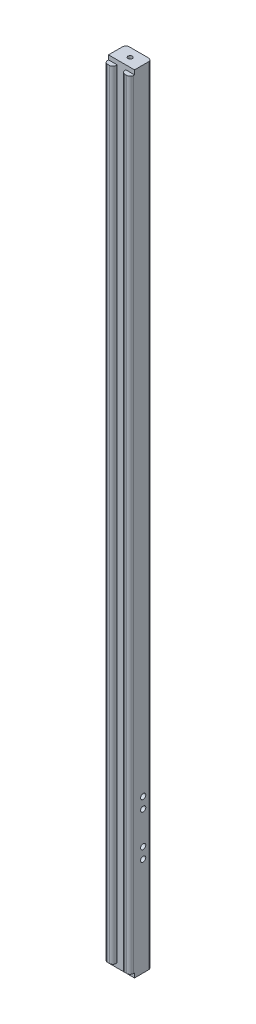
ISO-10303-21;
HEADER;
FILE_DESCRIPTION(('STEP AP214'),'2;1');
FILE_NAME('part.step','',(''),(''),'','','');
FILE_SCHEMA(('AUTOMOTIVE_DESIGN { 1 0 10303 214 1 1 1 1 }'));
ENDSEC;
DATA;
#1=APPLICATION_CONTEXT('core data for automotive mechanical design processes');
#2=APPLICATION_PROTOCOL_DEFINITION('international standard','automotive_design',2000,#1);
#3=PRODUCT_CONTEXT('',#1,'mechanical');
#4=PRODUCT('Part','Part','',(#3));
#5=PRODUCT_RELATED_PRODUCT_CATEGORY('part','',(#4));
#6=PRODUCT_DEFINITION_FORMATION('','',#4);
#7=PRODUCT_DEFINITION_CONTEXT('part definition',#1,'design');
#8=PRODUCT_DEFINITION('design','',#6,#7);
#9=PRODUCT_DEFINITION_SHAPE('','',#8);
#10=(LENGTH_UNIT() NAMED_UNIT(*) SI_UNIT(.MILLI.,.METRE.));
#11=(NAMED_UNIT(*) PLANE_ANGLE_UNIT() SI_UNIT($,.RADIAN.));
#12=(NAMED_UNIT(*) SI_UNIT($,.STERADIAN.) SOLID_ANGLE_UNIT());
#13=UNCERTAINTY_MEASURE_WITH_UNIT(LENGTH_MEASURE(1.E-05),#10,'distance_accuracy_value','');
#14=(GEOMETRIC_REPRESENTATION_CONTEXT(3) GLOBAL_UNCERTAINTY_ASSIGNED_CONTEXT((#13)) GLOBAL_UNIT_ASSIGNED_CONTEXT((#10,
#11,#12)) REPRESENTATION_CONTEXT('',''));
#15=CARTESIAN_POINT('',(0.,0.,0.));
#16=DIRECTION('',(0.,0.,1.));
#17=DIRECTION('',(1.,0.,0.));
#18=AXIS2_PLACEMENT_3D('',#15,#16,#17);
#19=CARTESIAN_POINT('',(-15.,453.5,12.5));
#20=DIRECTION('',(0.,-1.,0.));
#21=DIRECTION('',(0.,0.,-1.));
#22=AXIS2_PLACEMENT_3D('',#19,#20,#21);
#23=PLANE('',#22);
#24=CARTESIAN_POINT('',(-15.,453.5,10.));
#25=DIRECTION('',(0.,1.,0.));
#26=DIRECTION('',(1.,0.,0.));
#27=AXIS2_PLACEMENT_3D('',#24,#25,#26);
#28=CIRCLE('',#27,2.5);
#29=CARTESIAN_POINT('',(-17.5,453.5,10.));
#30=VERTEX_POINT('',#29);
#31=EDGE_CURVE('E264',#30,#30,#28,.T.);
#32=ORIENTED_EDGE('',*,*,#31,.F.);
#33=EDGE_LOOP('',(#32));
#34=FACE_BOUND('',#33,.T.);
#35=CARTESIAN_POINT('',(-26.,453.5,4.));
#36=DIRECTION('',(0.,1.,0.));
#37=DIRECTION('',(-0.707106781186548,0.,-0.707106781186547));
#38=AXIS2_PLACEMENT_3D('',#35,#36,#37);
#39=CIRCLE('',#38,4.);
#40=CARTESIAN_POINT('',(-26.,453.5,0.));
#41=VERTEX_POINT('',#40);
#42=CARTESIAN_POINT('',(-30.,453.5,4.));
#43=VERTEX_POINT('',#42);
#44=EDGE_CURVE('E300',#41,#43,#39,.T.);
#45=ORIENTED_EDGE('',*,*,#44,.T.);
#46=DIRECTION('',(0.,0.,-1.));
#47=VECTOR('',#46,1.);
#48=CARTESIAN_POINT('',(-30.,453.5,25.));
#49=LINE('',#48,#47);
#50=CARTESIAN_POINT('',(-30.,453.5,20.));
#51=VERTEX_POINT('',#50);
#52=EDGE_CURVE('E256',#51,#43,#49,.T.);
#53=ORIENTED_EDGE('',*,*,#52,.F.);
#54=DIRECTION('',(-1.,0.,0.));
#55=VECTOR('',#54,1.);
#56=CARTESIAN_POINT('',(-7.5,453.5,20.));
#57=LINE('',#56,#55);
#58=CARTESIAN_POINT('',(0.,453.5,20.));
#59=VERTEX_POINT('',#58);
#60=EDGE_CURVE('E257',#59,#51,#57,.T.);
#61=ORIENTED_EDGE('',*,*,#60,.F.);
#62=DIRECTION('',(0.,0.,1.));
#63=VECTOR('',#62,1.);
#64=CARTESIAN_POINT('',(0.,453.5,0.));
#65=LINE('',#64,#63);
#66=CARTESIAN_POINT('',(0.,453.5,4.));
#67=VERTEX_POINT('',#66);
#68=EDGE_CURVE('E433',#67,#59,#65,.T.);
#69=ORIENTED_EDGE('',*,*,#68,.F.);
#70=CARTESIAN_POINT('',(-4.,453.5,4.));
#71=DIRECTION('',(0.,1.,0.));
#72=DIRECTION('',(0.707106781186548,0.,-0.707106781186547));
#73=AXIS2_PLACEMENT_3D('',#70,#71,#72);
#74=CIRCLE('',#73,4.);
#75=CARTESIAN_POINT('',(-4.,453.5,0.));
#76=VERTEX_POINT('',#75);
#77=EDGE_CURVE('E354',#67,#76,#74,.T.);
#78=ORIENTED_EDGE('',*,*,#77,.T.);
#79=DIRECTION('',(1.,0.,0.));
#80=VECTOR('',#79,1.);
#81=CARTESIAN_POINT('',(-30.,453.5,0.));
#82=LINE('',#81,#80);
#83=EDGE_CURVE('E397',#41,#76,#82,.T.);
#84=ORIENTED_EDGE('',*,*,#83,.F.);
#85=EDGE_LOOP('',(#45,#53,#61,#69,#78,#84));
#86=FACE_BOUND('',#85,.T.);
#87=ADVANCED_FACE('F17',(#34,#86),#23,.F.);
#88=CARTESIAN_POINT('',(-15.,448.5,22.5));
#89=DIRECTION('',(0.,1.,0.));
#90=DIRECTION('',(1.,0.,0.));
#91=AXIS2_PLACEMENT_3D('',#88,#89,#90);
#92=PLANE('',#91);
#93=CARTESIAN_POINT('',(-24.,448.5,21.));
#94=DIRECTION('',(0.,1.,0.));
#95=DIRECTION('',(0.707106781186548,0.,0.707106781186547));
#96=AXIS2_PLACEMENT_3D('',#93,#94,#95);
#97=CIRCLE('',#96,4.);
#98=CARTESIAN_POINT('',(-24.,448.5,25.));
#99=VERTEX_POINT('',#98);
#100=CARTESIAN_POINT('',(-20.,448.5,21.));
#101=VERTEX_POINT('',#100);
#102=EDGE_CURVE('E291',#99,#101,#97,.T.);
#103=ORIENTED_EDGE('',*,*,#102,.T.);
#104=DIRECTION('',(0.,0.,-1.));
#105=VECTOR('',#104,1.);
#106=CARTESIAN_POINT('',(-20.,448.5,21.25));
#107=LINE('',#106,#105);
#108=CARTESIAN_POINT('',(-20.,448.5,20.));
#109=VERTEX_POINT('',#108);
#110=EDGE_CURVE('E261',#101,#109,#107,.T.);
#111=ORIENTED_EDGE('',*,*,#110,.T.);
#112=DIRECTION('',(-1.,0.,0.));
#113=VECTOR('',#112,1.);
#114=CARTESIAN_POINT('',(-30.,448.5,20.));
#115=LINE('',#114,#113);
#116=CARTESIAN_POINT('',(-30.,448.5,20.));
#117=VERTEX_POINT('',#116);
#118=EDGE_CURVE('E184',#109,#117,#115,.T.);
#119=ORIENTED_EDGE('',*,*,#118,.T.);
#120=DIRECTION('',(0.,0.,1.));
#121=VECTOR('',#120,1.);
#122=CARTESIAN_POINT('',(-30.,448.5,23.75));
#123=LINE('',#122,#121);
#124=CARTESIAN_POINT('',(-30.,448.5,21.));
#125=VERTEX_POINT('',#124);
#126=EDGE_CURVE('E175',#117,#125,#123,.T.);
#127=ORIENTED_EDGE('',*,*,#126,.T.);
#128=CARTESIAN_POINT('',(-26.,448.5,21.));
#129=DIRECTION('',(0.,1.,0.));
#130=DIRECTION('',(-0.707106781186547,0.,0.707106781186548));
#131=AXIS2_PLACEMENT_3D('',#128,#129,#130);
#132=CIRCLE('',#131,4.);
#133=CARTESIAN_POINT('',(-26.,448.5,25.));
#134=VERTEX_POINT('',#133);
#135=EDGE_CURVE('E249',#125,#134,#132,.T.);
#136=ORIENTED_EDGE('',*,*,#135,.T.);
#137=DIRECTION('',(1.,0.,0.));
#138=VECTOR('',#137,1.);
#139=CARTESIAN_POINT('',(-17.5,448.5,25.));
#140=LINE('',#139,#138);
#141=EDGE_CURVE('E317',#134,#99,#140,.T.);
#142=ORIENTED_EDGE('',*,*,#141,.T.);
#143=EDGE_LOOP('',(#103,#111,#119,#127,#136,#142));
#144=FACE_BOUND('',#143,.T.);
#145=ADVANCED_FACE('F843',(#144),#92,.T.);
#146=CARTESIAN_POINT('',(-15.,448.5,22.5));
#147=DIRECTION('',(0.,1.,0.));
#148=DIRECTION('',(1.,0.,0.));
#149=AXIS2_PLACEMENT_3D('',#146,#147,#148);
#150=PLANE('',#149);
#151=CARTESIAN_POINT('',(-4.,448.5,21.));
#152=DIRECTION('',(0.,1.,0.));
#153=DIRECTION('',(0.707106781186548,0.,0.707106781186547));
#154=AXIS2_PLACEMENT_3D('',#151,#152,#153);
#155=CIRCLE('',#154,4.);
#156=CARTESIAN_POINT('',(-4.,448.5,25.));
#157=VERTEX_POINT('',#156);
#158=CARTESIAN_POINT('',(0.,448.5,21.));
#159=VERTEX_POINT('',#158);
#160=EDGE_CURVE('E411',#157,#159,#155,.T.);
#161=ORIENTED_EDGE('',*,*,#160,.T.);
#162=DIRECTION('',(0.,0.,-1.));
#163=VECTOR('',#162,1.);
#164=CARTESIAN_POINT('',(0.,448.5,11.25));
#165=LINE('',#164,#163);
#166=CARTESIAN_POINT('',(0.,448.5,20.));
#167=VERTEX_POINT('',#166);
#168=EDGE_CURVE('E84',#159,#167,#165,.T.);
#169=ORIENTED_EDGE('',*,*,#168,.T.);
#170=DIRECTION('',(-1.,0.,0.));
#171=VECTOR('',#170,1.);
#172=CARTESIAN_POINT('',(-30.,448.5,20.));
#173=LINE('',#172,#171);
#174=CARTESIAN_POINT('',(-10.,448.5,20.));
#175=VERTEX_POINT('',#174);
#176=EDGE_CURVE('E260',#167,#175,#173,.T.);
#177=ORIENTED_EDGE('',*,*,#176,.T.);
#178=DIRECTION('',(0.,0.,1.));
#179=VECTOR('',#178,1.);
#180=CARTESIAN_POINT('',(-10.,448.5,23.75));
#181=LINE('',#180,#179);
#182=CARTESIAN_POINT('',(-10.,448.5,21.));
#183=VERTEX_POINT('',#182);
#184=EDGE_CURVE('E370',#175,#183,#181,.T.);
#185=ORIENTED_EDGE('',*,*,#184,.T.);
#186=CARTESIAN_POINT('',(-6.,448.5,21.));
#187=DIRECTION('',(0.,1.,0.));
#188=DIRECTION('',(-0.707106781186547,0.,0.707106781186548));
#189=AXIS2_PLACEMENT_3D('',#186,#187,#188);
#190=CIRCLE('',#189,4.);
#191=CARTESIAN_POINT('',(-6.,448.5,25.));
#192=VERTEX_POINT('',#191);
#193=EDGE_CURVE('E405',#183,#192,#190,.T.);
#194=ORIENTED_EDGE('',*,*,#193,.T.);
#195=DIRECTION('',(1.,0.,0.));
#196=VECTOR('',#195,1.);
#197=CARTESIAN_POINT('',(-7.5,448.5,25.));
#198=LINE('',#197,#196);
#199=EDGE_CURVE('E21',#192,#157,#198,.T.);
#200=ORIENTED_EDGE('',*,*,#199,.T.);
#201=EDGE_LOOP('',(#161,#169,#177,#185,#194,#200));
#202=FACE_BOUND('',#201,.T.);
#203=ADVANCED_FACE('F823',(#202),#150,.T.);
#204=CARTESIAN_POINT('',(-15.,413.5,10.));
#205=DIRECTION('',(0.,-1.,0.));
#206=DIRECTION('',(0.,0.,-1.));
#207=AXIS2_PLACEMENT_3D('',#204,#205,#206);
#208=PLANE('',#207);
#209=CARTESIAN_POINT('',(-15.,413.5,10.));
#210=DIRECTION('',(0.,1.,0.));
#211=DIRECTION('',(1.,0.,0.));
#212=AXIS2_PLACEMENT_3D('',#209,#210,#211);
#213=CIRCLE('',#212,2.5);
#214=CARTESIAN_POINT('',(-17.5,413.5,10.));
#215=VERTEX_POINT('',#214);
#216=EDGE_CURVE('E11',#215,#215,#213,.T.);
#217=ORIENTED_EDGE('',*,*,#216,.T.);
#218=EDGE_LOOP('',(#217));
#219=FACE_BOUND('',#218,.T.);
#220=ADVANCED_FACE('F807',(#219),#208,.F.);
#221=CARTESIAN_POINT('',(-15.,453.5,10.));
#222=DIRECTION('',(0.,1.,0.));
#223=DIRECTION('',(1.,0.,0.));
#224=AXIS2_PLACEMENT_3D('',#221,#222,#223);
#225=CYLINDRICAL_SURFACE('',#224,2.5);
#226=ORIENTED_EDGE('',*,*,#31,.T.);
#227=DIRECTION('',(0.,-1.,0.));
#228=VECTOR('',#227,1.);
#229=CARTESIAN_POINT('',(-17.5,453.5,10.));
#230=LINE('',#229,#228);
#231=EDGE_CURVE('E28',#30,#215,#230,.T.);
#232=ORIENTED_EDGE('',*,*,#231,.T.);
#233=ORIENTED_EDGE('',*,*,#216,.F.);
#234=ORIENTED_EDGE('',*,*,#231,.F.);
#235=EDGE_LOOP('',(#226,#232,#233,#234));
#236=FACE_BOUND('',#235,.T.);
#237=ADVANCED_FACE('F802',(#236),#225,.F.);
#238=CARTESIAN_POINT('',(-20.,0.,20.));
#239=DIRECTION('',(-1.,0.,0.));
#240=DIRECTION('',(0.,0.,1.));
#241=AXIS2_PLACEMENT_3D('',#238,#239,#240);
#242=PLANE('',#241);
#243=DIRECTION('',(0.,-1.,0.));
#244=VECTOR('',#243,1.);
#245=CARTESIAN_POINT('',(-20.,0.,21.));
#246=LINE('',#245,#244);
#247=CARTESIAN_POINT('',(-20.,-448.5,21.));
#248=VERTEX_POINT('',#247);
#249=EDGE_CURVE('E325',#101,#248,#246,.T.);
#250=ORIENTED_EDGE('',*,*,#249,.T.);
#251=DIRECTION('',(0.,0.,1.));
#252=VECTOR('',#251,1.);
#253=CARTESIAN_POINT('',(-20.,-448.5,21.25));
#254=LINE('',#253,#252);
#255=CARTESIAN_POINT('',(-20.,-448.5,20.));
#256=VERTEX_POINT('',#255);
#257=EDGE_CURVE('E402',#256,#248,#254,.T.);
#258=ORIENTED_EDGE('',*,*,#257,.F.);
#259=DIRECTION('',(0.,1.,0.));
#260=VECTOR('',#259,1.);
#261=CARTESIAN_POINT('',(-20.,0.,20.));
#262=LINE('',#261,#260);
#263=EDGE_CURVE('E243',#256,#109,#262,.T.);
#264=ORIENTED_EDGE('',*,*,#263,.T.);
#265=ORIENTED_EDGE('',*,*,#110,.F.);
#266=EDGE_LOOP('',(#250,#258,#264,#265));
#267=FACE_BOUND('',#266,.T.);
#268=ADVANCED_FACE('F806',(#267),#242,.F.);
#269=CARTESIAN_POINT('',(-10.,0.,20.));
#270=DIRECTION('',(0.,0.,-1.));
#271=DIRECTION('',(0.,-1.,0.));
#272=AXIS2_PLACEMENT_3D('',#269,#270,#271);
#273=PLANE('',#272);
#274=ORIENTED_EDGE('',*,*,#263,.F.);
#275=DIRECTION('',(-1.,0.,0.));
#276=VECTOR('',#275,1.);
#277=CARTESIAN_POINT('',(-30.,-448.5,20.));
#278=LINE('',#277,#276);
#279=CARTESIAN_POINT('',(-30.,-448.5,20.));
#280=VERTEX_POINT('',#279);
#281=EDGE_CURVE('E398',#256,#280,#278,.T.);
#282=ORIENTED_EDGE('',*,*,#281,.T.);
#283=DIRECTION('',(0.,-1.,0.));
#284=VECTOR('',#283,1.);
#285=CARTESIAN_POINT('',(-30.,-226.75,20.));
#286=LINE('',#285,#284);
#287=CARTESIAN_POINT('',(-30.,-453.5,20.));
#288=VERTEX_POINT('',#287);
#289=EDGE_CURVE('E297',#280,#288,#286,.T.);
#290=ORIENTED_EDGE('',*,*,#289,.T.);
#291=DIRECTION('',(1.,0.,0.));
#292=VECTOR('',#291,1.);
#293=CARTESIAN_POINT('',(-7.5,-453.5,20.));
#294=LINE('',#293,#292);
#295=CARTESIAN_POINT('',(0.,-453.5,20.));
#296=VERTEX_POINT('',#295);
#297=EDGE_CURVE('E278',#288,#296,#294,.T.);
#298=ORIENTED_EDGE('',*,*,#297,.T.);
#299=DIRECTION('',(0.,1.,0.));
#300=VECTOR('',#299,1.);
#301=CARTESIAN_POINT('',(0.,-226.75,20.));
#302=LINE('',#301,#300);
#303=CARTESIAN_POINT('',(0.,-448.5,20.));
#304=VERTEX_POINT('',#303);
#305=EDGE_CURVE('E430',#296,#304,#302,.T.);
#306=ORIENTED_EDGE('',*,*,#305,.T.);
#307=DIRECTION('',(-1.,0.,0.));
#308=VECTOR('',#307,1.);
#309=CARTESIAN_POINT('',(-30.,-448.5,20.));
#310=LINE('',#309,#308);
#311=CARTESIAN_POINT('',(-10.,-448.5,20.));
#312=VERTEX_POINT('',#311);
#313=EDGE_CURVE('E406',#304,#312,#310,.T.);
#314=ORIENTED_EDGE('',*,*,#313,.T.);
#315=DIRECTION('',(0.,1.,0.));
#316=VECTOR('',#315,1.);
#317=CARTESIAN_POINT('',(-10.,0.,20.));
#318=LINE('',#317,#316);
#319=EDGE_CURVE('E296',#312,#175,#318,.T.);
#320=ORIENTED_EDGE('',*,*,#319,.T.);
#321=ORIENTED_EDGE('',*,*,#176,.F.);
#322=DIRECTION('',(0.,1.,0.));
#323=VECTOR('',#322,1.);
#324=CARTESIAN_POINT('',(0.,226.75,20.));
#325=LINE('',#324,#323);
#326=EDGE_CURVE('E245',#167,#59,#325,.T.);
#327=ORIENTED_EDGE('',*,*,#326,.T.);
#328=ORIENTED_EDGE('',*,*,#60,.T.);
#329=DIRECTION('',(0.,-1.,0.));
#330=VECTOR('',#329,1.);
#331=CARTESIAN_POINT('',(-30.,226.75,20.));
#332=LINE('',#331,#330);
#333=EDGE_CURVE('E381',#51,#117,#332,.T.);
#334=ORIENTED_EDGE('',*,*,#333,.T.);
#335=ORIENTED_EDGE('',*,*,#118,.F.);
#336=EDGE_LOOP('',(#274,#282,#290,#298,#306,#314,#320,#321,#327,#328,#334,#335));
#337=FACE_BOUND('',#336,.T.);
#338=ADVANCED_FACE('F762',(#337),#273,.F.);
#339=CARTESIAN_POINT('',(-15.,-413.5,10.));
#340=DIRECTION('',(0.,-1.,0.));
#341=DIRECTION('',(0.,0.,-1.));
#342=AXIS2_PLACEMENT_3D('',#339,#340,#341);
#343=PLANE('',#342);
#344=CARTESIAN_POINT('',(-15.,-413.5,10.));
#345=DIRECTION('',(0.,1.,0.));
#346=DIRECTION('',(1.,0.,0.));
#347=AXIS2_PLACEMENT_3D('',#344,#345,#346);
#348=CIRCLE('',#347,2.5);
#349=CARTESIAN_POINT('',(-17.5,-413.5,10.));
#350=VERTEX_POINT('',#349);
#351=EDGE_CURVE('E235',#350,#350,#348,.T.);
#352=ORIENTED_EDGE('',*,*,#351,.F.);
#353=EDGE_LOOP('',(#352));
#354=FACE_BOUND('',#353,.T.);
#355=ADVANCED_FACE('F758',(#354),#343,.T.);
#356=CARTESIAN_POINT('',(-15.,-453.5,10.));
#357=DIRECTION('',(0.,1.,0.));
#358=DIRECTION('',(1.,0.,0.));
#359=AXIS2_PLACEMENT_3D('',#356,#357,#358);
#360=CYLINDRICAL_SURFACE('',#359,2.5);
#361=CARTESIAN_POINT('',(-15.,-453.5,10.));
#362=DIRECTION('',(0.,-1.,0.));
#363=DIRECTION('',(1.,0.,0.));
#364=AXIS2_PLACEMENT_3D('',#361,#362,#363);
#365=CIRCLE('',#364,2.5);
#366=CARTESIAN_POINT('',(-17.5,-453.5,10.));
#367=VERTEX_POINT('',#366);
#368=EDGE_CURVE('E233',#367,#367,#365,.T.);
#369=ORIENTED_EDGE('',*,*,#368,.T.);
#370=DIRECTION('',(0.,1.,0.));
#371=VECTOR('',#370,1.);
#372=CARTESIAN_POINT('',(-17.5,-453.5,10.));
#373=LINE('',#372,#371);
#374=EDGE_CURVE('E230',#367,#350,#373,.T.);
#375=ORIENTED_EDGE('',*,*,#374,.T.);
#376=ORIENTED_EDGE('',*,*,#351,.T.);
#377=ORIENTED_EDGE('',*,*,#374,.F.);
#378=EDGE_LOOP('',(#369,#375,#376,#377));
#379=FACE_BOUND('',#378,.T.);
#380=ADVANCED_FACE('F231',(#379),#360,.F.);
#381=CARTESIAN_POINT('',(0.,0.,0.));
#382=DIRECTION('',(-1.,0.,0.));
#383=DIRECTION('',(0.,0.,1.));
#384=AXIS2_PLACEMENT_3D('',#381,#382,#383);
#385=PLANE('',#384);
#386=CARTESIAN_POINT('',(0.,-277.225,10.));
#387=DIRECTION('',(1.,0.,0.));
#388=DIRECTION('',(0.,0.,-1.));
#389=AXIS2_PLACEMENT_3D('',#386,#387,#388);
#390=CIRCLE('',#389,3.);
#391=CARTESIAN_POINT('',(0.,-277.225,13.));
#392=VERTEX_POINT('',#391);
#393=EDGE_CURVE('E334',#392,#392,#390,.T.);
#394=ORIENTED_EDGE('',*,*,#393,.F.);
#395=EDGE_LOOP('',(#394));
#396=FACE_BOUND('',#395,.T.);
#397=CARTESIAN_POINT('',(0.,-339.775,10.));
#398=DIRECTION('',(1.,0.,0.));
#399=DIRECTION('',(0.,0.,-1.));
#400=AXIS2_PLACEMENT_3D('',#397,#398,#399);
#401=CIRCLE('',#400,3.);
#402=CARTESIAN_POINT('',(0.,-339.775,13.));
#403=VERTEX_POINT('',#402);
#404=EDGE_CURVE('E273',#403,#403,#401,.T.);
#405=ORIENTED_EDGE('',*,*,#404,.F.);
#406=EDGE_LOOP('',(#405));
#407=FACE_BOUND('',#406,.T.);
#408=CARTESIAN_POINT('',(0.,-289.725,10.));
#409=DIRECTION('',(1.,0.,0.));
#410=DIRECTION('',(0.,0.,-1.));
#411=AXIS2_PLACEMENT_3D('',#408,#409,#410);
#412=CIRCLE('',#411,3.);
#413=CARTESIAN_POINT('',(0.,-289.725,13.));
#414=VERTEX_POINT('',#413);
#415=EDGE_CURVE('E362',#414,#414,#412,.T.);
#416=ORIENTED_EDGE('',*,*,#415,.F.);
#417=EDGE_LOOP('',(#416));
#418=FACE_BOUND('',#417,.T.);
#419=CARTESIAN_POINT('',(0.,-327.275,10.));
#420=DIRECTION('',(1.,0.,0.));
#421=DIRECTION('',(0.,0.,-1.));
#422=AXIS2_PLACEMENT_3D('',#419,#420,#421);
#423=CIRCLE('',#422,3.);
#424=CARTESIAN_POINT('',(0.,-327.275,13.));
#425=VERTEX_POINT('',#424);
#426=EDGE_CURVE('E392',#425,#425,#423,.T.);
#427=ORIENTED_EDGE('',*,*,#426,.F.);
#428=EDGE_LOOP('',(#427));
#429=FACE_BOUND('',#428,.T.);
#430=DIRECTION('',(0.,-1.,0.));
#431=VECTOR('',#430,1.);
#432=CARTESIAN_POINT('',(0.,0.,21.));
#433=LINE('',#432,#431);
#434=CARTESIAN_POINT('',(0.,-448.5,21.));
#435=VERTEX_POINT('',#434);
#436=EDGE_CURVE('E408',#159,#435,#433,.T.);
#437=ORIENTED_EDGE('',*,*,#436,.T.);
#438=DIRECTION('',(0.,0.,1.));
#439=VECTOR('',#438,1.);
#440=CARTESIAN_POINT('',(0.,-448.5,11.25));
#441=LINE('',#440,#439);
#442=EDGE_CURVE('E403',#304,#435,#441,.T.);
#443=ORIENTED_EDGE('',*,*,#442,.F.);
#444=ORIENTED_EDGE('',*,*,#305,.F.);
#445=DIRECTION('',(0.,0.,1.));
#446=VECTOR('',#445,1.);
#447=CARTESIAN_POINT('',(0.,-453.5,0.));
#448=LINE('',#447,#446);
#449=CARTESIAN_POINT('',(0.,-453.5,4.));
#450=VERTEX_POINT('',#449);
#451=EDGE_CURVE('E274',#450,#296,#448,.T.);
#452=ORIENTED_EDGE('',*,*,#451,.F.);
#453=DIRECTION('',(0.,1.,0.));
#454=VECTOR('',#453,1.);
#455=CARTESIAN_POINT('',(0.,0.,4.));
#456=LINE('',#455,#454);
#457=EDGE_CURVE('E356',#450,#67,#456,.T.);
#458=ORIENTED_EDGE('',*,*,#457,.T.);
#459=ORIENTED_EDGE('',*,*,#68,.T.);
#460=ORIENTED_EDGE('',*,*,#326,.F.);
#461=ORIENTED_EDGE('',*,*,#168,.F.);
#462=EDGE_LOOP('',(#437,#443,#444,#452,#458,#459,#460,#461));
#463=FACE_BOUND('',#462,.T.);
#464=ADVANCED_FACE('F797',(#396,#407,#418,#429,#463),#385,.F.);
#465=CARTESIAN_POINT('',(-4.,0.,4.));
#466=DIRECTION('',(0.,-1.,0.));
#467=DIRECTION('',(0.707106781186548,0.,-0.707106781186547));
#468=AXIS2_PLACEMENT_3D('',#465,#466,#467);
#469=CYLINDRICAL_SURFACE('',#468,4.);
#470=ORIENTED_EDGE('',*,*,#77,.F.);
#471=ORIENTED_EDGE('',*,*,#457,.F.);
#472=CARTESIAN_POINT('',(-4.,-453.5,4.));
#473=DIRECTION('',(0.,-1.,0.));
#474=DIRECTION('',(0.707106781186548,0.,-0.707106781186547));
#475=AXIS2_PLACEMENT_3D('',#472,#473,#474);
#476=CIRCLE('',#475,4.);
#477=CARTESIAN_POINT('',(-4.,-453.5,0.));
#478=VERTEX_POINT('',#477);
#479=EDGE_CURVE('E279',#478,#450,#476,.T.);
#480=ORIENTED_EDGE('',*,*,#479,.F.);
#481=DIRECTION('',(0.,-1.,0.));
#482=VECTOR('',#481,1.);
#483=CARTESIAN_POINT('',(-4.,0.,0.));
#484=LINE('',#483,#482);
#485=EDGE_CURVE('E448',#76,#478,#484,.T.);
#486=ORIENTED_EDGE('',*,*,#485,.F.);
#487=EDGE_LOOP('',(#470,#471,#480,#486));
#488=FACE_BOUND('',#487,.T.);
#489=ADVANCED_FACE('F831',(#488),#469,.T.);
#490=CARTESIAN_POINT('',(-15.,-453.5,12.5));
#491=DIRECTION('',(0.,-1.,0.));
#492=DIRECTION('',(0.,0.,-1.));
#493=AXIS2_PLACEMENT_3D('',#490,#491,#492);
#494=PLANE('',#493);
#495=ORIENTED_EDGE('',*,*,#368,.F.);
#496=EDGE_LOOP('',(#495));
#497=FACE_BOUND('',#496,.T.);
#498=CARTESIAN_POINT('',(-26.,-453.5,4.));
#499=DIRECTION('',(0.,-1.,0.));
#500=DIRECTION('',(-0.707106781186548,0.,-0.707106781186547));
#501=AXIS2_PLACEMENT_3D('',#498,#499,#500);
#502=CIRCLE('',#501,4.);
#503=CARTESIAN_POINT('',(-30.,-453.5,4.));
#504=VERTEX_POINT('',#503);
#505=CARTESIAN_POINT('',(-26.,-453.5,0.));
#506=VERTEX_POINT('',#505);
#507=EDGE_CURVE('E393',#504,#506,#502,.T.);
#508=ORIENTED_EDGE('',*,*,#507,.T.);
#509=DIRECTION('',(1.,0.,0.));
#510=VECTOR('',#509,1.);
#511=CARTESIAN_POINT('',(-30.,-453.5,0.));
#512=LINE('',#511,#510);
#513=EDGE_CURVE('E329',#506,#478,#512,.T.);
#514=ORIENTED_EDGE('',*,*,#513,.T.);
#515=ORIENTED_EDGE('',*,*,#479,.T.);
#516=ORIENTED_EDGE('',*,*,#451,.T.);
#517=ORIENTED_EDGE('',*,*,#297,.F.);
#518=DIRECTION('',(0.,0.,-1.));
#519=VECTOR('',#518,1.);
#520=CARTESIAN_POINT('',(-30.,-453.5,25.));
#521=LINE('',#520,#519);
#522=EDGE_CURVE('E255',#288,#504,#521,.T.);
#523=ORIENTED_EDGE('',*,*,#522,.T.);
#524=EDGE_LOOP('',(#508,#514,#515,#516,#517,#523));
#525=FACE_BOUND('',#524,.T.);
#526=ADVANCED_FACE('F744',(#497,#525),#494,.T.);
#527=CARTESIAN_POINT('',(-30.,0.,0.));
#528=DIRECTION('',(0.,0.,1.));
#529=DIRECTION('',(1.,0.,0.));
#530=AXIS2_PLACEMENT_3D('',#527,#528,#529);
#531=PLANE('',#530);
#532=DIRECTION('',(0.,1.,0.));
#533=VECTOR('',#532,1.);
#534=CARTESIAN_POINT('',(-26.,0.,0.));
#535=LINE('',#534,#533);
#536=EDGE_CURVE('E333',#506,#41,#535,.T.);
#537=ORIENTED_EDGE('',*,*,#536,.T.);
#538=ORIENTED_EDGE('',*,*,#83,.T.);
#539=ORIENTED_EDGE('',*,*,#485,.T.);
#540=ORIENTED_EDGE('',*,*,#513,.F.);
#541=EDGE_LOOP('',(#537,#538,#539,#540));
#542=FACE_BOUND('',#541,.T.);
#543=ADVANCED_FACE('F19',(#542),#531,.F.);
#544=CARTESIAN_POINT('',(-26.,0.,4.));
#545=DIRECTION('',(0.,-1.,0.));
#546=DIRECTION('',(-0.707106781186548,0.,-0.707106781186547));
#547=AXIS2_PLACEMENT_3D('',#544,#545,#546);
#548=CYLINDRICAL_SURFACE('',#547,4.);
#549=ORIENTED_EDGE('',*,*,#44,.F.);
#550=ORIENTED_EDGE('',*,*,#536,.F.);
#551=ORIENTED_EDGE('',*,*,#507,.F.);
#552=DIRECTION('',(0.,-1.,0.));
#553=VECTOR('',#552,1.);
#554=CARTESIAN_POINT('',(-30.,0.,4.));
#555=LINE('',#554,#553);
#556=EDGE_CURVE('E251',#43,#504,#555,.T.);
#557=ORIENTED_EDGE('',*,*,#556,.F.);
#558=EDGE_LOOP('',(#549,#550,#551,#557));
#559=FACE_BOUND('',#558,.T.);
#560=ADVANCED_FACE('F505',(#559),#548,.T.);
#561=CARTESIAN_POINT('',(-30.,0.,25.));
#562=DIRECTION('',(1.,0.,0.));
#563=DIRECTION('',(0.,1.,0.));
#564=AXIS2_PLACEMENT_3D('',#561,#562,#563);
#565=PLANE('',#564);
#566=CARTESIAN_POINT('',(-30.,-277.225,10.));
#567=DIRECTION('',(-1.,0.,0.));
#568=DIRECTION('',(0.,0.,-1.));
#569=AXIS2_PLACEMENT_3D('',#566,#567,#568);
#570=CIRCLE('',#569,3.);
#571=CARTESIAN_POINT('',(-30.,-277.225,13.));
#572=VERTEX_POINT('',#571);
#573=EDGE_CURVE('E268',#572,#572,#570,.T.);
#574=ORIENTED_EDGE('',*,*,#573,.F.);
#575=EDGE_LOOP('',(#574));
#576=FACE_BOUND('',#575,.T.);
#577=CARTESIAN_POINT('',(-30.,-339.775,10.));
#578=DIRECTION('',(-1.,0.,0.));
#579=DIRECTION('',(0.,0.,-1.));
#580=AXIS2_PLACEMENT_3D('',#577,#578,#579);
#581=CIRCLE('',#580,3.);
#582=CARTESIAN_POINT('',(-30.,-339.775,13.));
#583=VERTEX_POINT('',#582);
#584=EDGE_CURVE('E353',#583,#583,#581,.T.);
#585=ORIENTED_EDGE('',*,*,#584,.F.);
#586=EDGE_LOOP('',(#585));
#587=FACE_BOUND('',#586,.T.);
#588=CARTESIAN_POINT('',(-30.,-289.725,10.));
#589=DIRECTION('',(-1.,0.,0.));
#590=DIRECTION('',(0.,0.,-1.));
#591=AXIS2_PLACEMENT_3D('',#588,#589,#590);
#592=CIRCLE('',#591,3.);
#593=CARTESIAN_POINT('',(-30.,-289.725,13.));
#594=VERTEX_POINT('',#593);
#595=EDGE_CURVE('E363',#594,#594,#592,.T.);
#596=ORIENTED_EDGE('',*,*,#595,.F.);
#597=EDGE_LOOP('',(#596));
#598=FACE_BOUND('',#597,.T.);
#599=CARTESIAN_POINT('',(-30.,-327.275,10.));
#600=DIRECTION('',(-1.,0.,0.));
#601=DIRECTION('',(0.,0.,-1.));
#602=AXIS2_PLACEMENT_3D('',#599,#600,#601);
#603=CIRCLE('',#602,3.);
#604=CARTESIAN_POINT('',(-30.,-327.275,13.));
#605=VERTEX_POINT('',#604);
#606=EDGE_CURVE('E286',#605,#605,#603,.T.);
#607=ORIENTED_EDGE('',*,*,#606,.F.);
#608=EDGE_LOOP('',(#607));
#609=FACE_BOUND('',#608,.T.);
#610=DIRECTION('',(0.,1.,0.));
#611=VECTOR('',#610,1.);
#612=CARTESIAN_POINT('',(-30.,0.,21.));
#613=LINE('',#612,#611);
#614=CARTESIAN_POINT('',(-30.,-448.5,21.));
#615=VERTEX_POINT('',#614);
#616=EDGE_CURVE('E265',#615,#125,#613,.T.);
#617=ORIENTED_EDGE('',*,*,#616,.T.);
#618=ORIENTED_EDGE('',*,*,#126,.F.);
#619=ORIENTED_EDGE('',*,*,#333,.F.);
#620=ORIENTED_EDGE('',*,*,#52,.T.);
#621=ORIENTED_EDGE('',*,*,#556,.T.);
#622=ORIENTED_EDGE('',*,*,#522,.F.);
#623=ORIENTED_EDGE('',*,*,#289,.F.);
#624=DIRECTION('',(0.,0.,-1.));
#625=VECTOR('',#624,1.);
#626=CARTESIAN_POINT('',(-30.,-448.5,23.75));
#627=LINE('',#626,#625);
#628=EDGE_CURVE('E315',#615,#280,#627,.T.);
#629=ORIENTED_EDGE('',*,*,#628,.F.);
#630=EDGE_LOOP('',(#617,#618,#619,#620,#621,#622,#623,#629));
#631=FACE_BOUND('',#630,.T.);
#632=ADVANCED_FACE('F501',(#576,#587,#598,#609,#631),#565,.F.);
#633=CARTESIAN_POINT('',(-26.,0.,21.));
#634=DIRECTION('',(0.,-1.,0.));
#635=DIRECTION('',(-0.707106781186547,0.,0.707106781186548));
#636=AXIS2_PLACEMENT_3D('',#633,#634,#635);
#637=CYLINDRICAL_SURFACE('',#636,4.);
#638=ORIENTED_EDGE('',*,*,#135,.F.);
#639=ORIENTED_EDGE('',*,*,#616,.F.);
#640=CARTESIAN_POINT('',(-26.,-448.5,21.));
#641=DIRECTION('',(0.,-1.,0.));
#642=DIRECTION('',(-0.707106781186547,0.,0.707106781186548));
#643=AXIS2_PLACEMENT_3D('',#640,#641,#642);
#644=CIRCLE('',#643,4.);
#645=CARTESIAN_POINT('',(-26.,-448.5,25.));
#646=VERTEX_POINT('',#645);
#647=EDGE_CURVE('E304',#646,#615,#644,.T.);
#648=ORIENTED_EDGE('',*,*,#647,.F.);
#649=DIRECTION('',(0.,-1.,0.));
#650=VECTOR('',#649,1.);
#651=CARTESIAN_POINT('',(-26.,0.,25.));
#652=LINE('',#651,#650);
#653=EDGE_CURVE('E305',#134,#646,#652,.T.);
#654=ORIENTED_EDGE('',*,*,#653,.F.);
#655=EDGE_LOOP('',(#638,#639,#648,#654));
#656=FACE_BOUND('',#655,.T.);
#657=ADVANCED_FACE('F504',(#656),#637,.T.);
#658=CARTESIAN_POINT('',(-15.,-448.5,22.5));
#659=DIRECTION('',(0.,1.,0.));
#660=DIRECTION('',(1.,0.,0.));
#661=AXIS2_PLACEMENT_3D('',#658,#659,#660);
#662=PLANE('',#661);
#663=CARTESIAN_POINT('',(-24.,-448.5,21.));
#664=DIRECTION('',(0.,-1.,0.));
#665=DIRECTION('',(0.707106781186548,0.,0.707106781186547));
#666=AXIS2_PLACEMENT_3D('',#663,#664,#665);
#667=CIRCLE('',#666,4.);
#668=CARTESIAN_POINT('',(-24.,-448.5,25.));
#669=VERTEX_POINT('',#668);
#670=EDGE_CURVE('E338',#248,#669,#667,.T.);
#671=ORIENTED_EDGE('',*,*,#670,.T.);
#672=DIRECTION('',(-1.,0.,0.));
#673=VECTOR('',#672,1.);
#674=CARTESIAN_POINT('',(-17.5,-448.5,25.));
#675=LINE('',#674,#673);
#676=EDGE_CURVE('E301',#669,#646,#675,.T.);
#677=ORIENTED_EDGE('',*,*,#676,.T.);
#678=ORIENTED_EDGE('',*,*,#647,.T.);
#679=ORIENTED_EDGE('',*,*,#628,.T.);
#680=ORIENTED_EDGE('',*,*,#281,.F.);
#681=ORIENTED_EDGE('',*,*,#257,.T.);
#682=EDGE_LOOP('',(#671,#677,#678,#679,#680,#681));
#683=FACE_BOUND('',#682,.T.);
#684=ADVANCED_FACE('F754',(#683),#662,.F.);
#685=CARTESIAN_POINT('',(-20.,0.,25.));
#686=DIRECTION('',(0.,0.,-1.));
#687=DIRECTION('',(0.,-1.,0.));
#688=AXIS2_PLACEMENT_3D('',#685,#686,#687);
#689=PLANE('',#688);
#690=DIRECTION('',(0.,1.,0.));
#691=VECTOR('',#690,1.);
#692=CARTESIAN_POINT('',(-24.,0.,25.));
#693=LINE('',#692,#691);
#694=EDGE_CURVE('E295',#669,#99,#693,.T.);
#695=ORIENTED_EDGE('',*,*,#694,.T.);
#696=ORIENTED_EDGE('',*,*,#141,.F.);
#697=ORIENTED_EDGE('',*,*,#653,.T.);
#698=ORIENTED_EDGE('',*,*,#676,.F.);
#699=EDGE_LOOP('',(#695,#696,#697,#698));
#700=FACE_BOUND('',#699,.T.);
#701=ADVANCED_FACE('F749',(#700),#689,.F.);
#702=CARTESIAN_POINT('',(-24.,0.,21.));
#703=DIRECTION('',(0.,-1.,0.));
#704=DIRECTION('',(0.707106781186548,0.,0.707106781186547));
#705=AXIS2_PLACEMENT_3D('',#702,#703,#704);
#706=CYLINDRICAL_SURFACE('',#705,4.);
#707=ORIENTED_EDGE('',*,*,#102,.F.);
#708=ORIENTED_EDGE('',*,*,#694,.F.);
#709=ORIENTED_EDGE('',*,*,#670,.F.);
#710=ORIENTED_EDGE('',*,*,#249,.F.);
#711=EDGE_LOOP('',(#707,#708,#709,#710));
#712=FACE_BOUND('',#711,.T.);
#713=ADVANCED_FACE('F753',(#712),#706,.T.);
#714=CARTESIAN_POINT('',(-10.,0.,25.));
#715=DIRECTION('',(1.,0.,0.));
#716=DIRECTION('',(0.,1.,0.));
#717=AXIS2_PLACEMENT_3D('',#714,#715,#716);
#718=PLANE('',#717);
#719=DIRECTION('',(0.,1.,0.));
#720=VECTOR('',#719,1.);
#721=CARTESIAN_POINT('',(-10.,0.,21.));
#722=LINE('',#721,#720);
#723=CARTESIAN_POINT('',(-10.,-448.5,21.));
#724=VERTEX_POINT('',#723);
#725=EDGE_CURVE('E372',#724,#183,#722,.T.);
#726=ORIENTED_EDGE('',*,*,#725,.T.);
#727=ORIENTED_EDGE('',*,*,#184,.F.);
#728=ORIENTED_EDGE('',*,*,#319,.F.);
#729=DIRECTION('',(0.,0.,-1.));
#730=VECTOR('',#729,1.);
#731=CARTESIAN_POINT('',(-10.,-448.5,23.75));
#732=LINE('',#731,#730);
#733=EDGE_CURVE('E345',#724,#312,#732,.T.);
#734=ORIENTED_EDGE('',*,*,#733,.F.);
#735=EDGE_LOOP('',(#726,#727,#728,#734));
#736=FACE_BOUND('',#735,.T.);
#737=ADVANCED_FACE('F773',(#736),#718,.F.);
#738=CARTESIAN_POINT('',(-6.,0.,21.));
#739=DIRECTION('',(0.,-1.,0.));
#740=DIRECTION('',(-0.707106781186547,0.,0.707106781186548));
#741=AXIS2_PLACEMENT_3D('',#738,#739,#740);
#742=CYLINDRICAL_SURFACE('',#741,4.);
#743=ORIENTED_EDGE('',*,*,#193,.F.);
#744=ORIENTED_EDGE('',*,*,#725,.F.);
#745=CARTESIAN_POINT('',(-6.,-448.5,21.));
#746=DIRECTION('',(0.,-1.,0.));
#747=DIRECTION('',(-0.707106781186547,0.,0.707106781186548));
#748=AXIS2_PLACEMENT_3D('',#745,#746,#747);
#749=CIRCLE('',#748,4.);
#750=CARTESIAN_POINT('',(-6.,-448.5,25.));
#751=VERTEX_POINT('',#750);
#752=EDGE_CURVE('E341',#751,#724,#749,.T.);
#753=ORIENTED_EDGE('',*,*,#752,.F.);
#754=DIRECTION('',(0.,-1.,0.));
#755=VECTOR('',#754,1.);
#756=CARTESIAN_POINT('',(-6.,0.,25.));
#757=LINE('',#756,#755);
#758=EDGE_CURVE('E447',#192,#751,#757,.T.);
#759=ORIENTED_EDGE('',*,*,#758,.F.);
#760=EDGE_LOOP('',(#743,#744,#753,#759));
#761=FACE_BOUND('',#760,.T.);
#762=ADVANCED_FACE('F768',(#761),#742,.T.);
#763=CARTESIAN_POINT('',(-15.,-448.5,22.5));
#764=DIRECTION('',(0.,1.,0.));
#765=DIRECTION('',(1.,0.,0.));
#766=AXIS2_PLACEMENT_3D('',#763,#764,#765);
#767=PLANE('',#766);
#768=CARTESIAN_POINT('',(-4.,-448.5,21.));
#769=DIRECTION('',(0.,-1.,0.));
#770=DIRECTION('',(0.707106781186548,0.,0.707106781186547));
#771=AXIS2_PLACEMENT_3D('',#768,#769,#770);
#772=CIRCLE('',#771,4.);
#773=CARTESIAN_POINT('',(-4.,-448.5,25.));
#774=VERTEX_POINT('',#773);
#775=EDGE_CURVE('E337',#435,#774,#772,.T.);
#776=ORIENTED_EDGE('',*,*,#775,.T.);
#777=DIRECTION('',(-1.,0.,0.));
#778=VECTOR('',#777,1.);
#779=CARTESIAN_POINT('',(-7.5,-448.5,25.));
#780=LINE('',#779,#778);
#781=EDGE_CURVE('E99',#774,#751,#780,.T.);
#782=ORIENTED_EDGE('',*,*,#781,.T.);
#783=ORIENTED_EDGE('',*,*,#752,.T.);
#784=ORIENTED_EDGE('',*,*,#733,.T.);
#785=ORIENTED_EDGE('',*,*,#313,.F.);
#786=ORIENTED_EDGE('',*,*,#442,.T.);
#787=EDGE_LOOP('',(#776,#782,#783,#784,#785,#786));
#788=FACE_BOUND('',#787,.T.);
#789=ADVANCED_FACE('F772',(#788),#767,.F.);
#790=CARTESIAN_POINT('',(0.,0.,25.));
#791=DIRECTION('',(0.,0.,-1.));
#792=DIRECTION('',(0.,-1.,0.));
#793=AXIS2_PLACEMENT_3D('',#790,#791,#792);
#794=PLANE('',#793);
#795=DIRECTION('',(0.,1.,0.));
#796=VECTOR('',#795,1.);
#797=CARTESIAN_POINT('',(-4.,0.,25.));
#798=LINE('',#797,#796);
#799=EDGE_CURVE('E439',#774,#157,#798,.T.);
#800=ORIENTED_EDGE('',*,*,#799,.T.);
#801=ORIENTED_EDGE('',*,*,#199,.F.);
#802=ORIENTED_EDGE('',*,*,#758,.T.);
#803=ORIENTED_EDGE('',*,*,#781,.F.);
#804=EDGE_LOOP('',(#800,#801,#802,#803));
#805=FACE_BOUND('',#804,.T.);
#806=ADVANCED_FACE('F788',(#805),#794,.F.);
#807=CARTESIAN_POINT('',(-4.,0.,21.));
#808=DIRECTION('',(0.,1.,0.));
#809=DIRECTION('',(0.707106781186548,0.,0.707106781186547));
#810=AXIS2_PLACEMENT_3D('',#807,#808,#809);
#811=CYLINDRICAL_SURFACE('',#810,4.);
#812=ORIENTED_EDGE('',*,*,#775,.F.);
#813=ORIENTED_EDGE('',*,*,#436,.F.);
#814=ORIENTED_EDGE('',*,*,#160,.F.);
#815=ORIENTED_EDGE('',*,*,#799,.F.);
#816=EDGE_LOOP('',(#812,#813,#814,#815));
#817=FACE_BOUND('',#816,.T.);
#818=ADVANCED_FACE('F732',(#817),#811,.T.);
#819=CARTESIAN_POINT('',(-30.,-277.225,10.));
#820=DIRECTION('',(-1.,0.,0.));
#821=DIRECTION('',(0.,0.,-1.));
#822=AXIS2_PLACEMENT_3D('',#819,#820,#821);
#823=CYLINDRICAL_SURFACE('',#822,3.);
#824=ORIENTED_EDGE('',*,*,#573,.T.);
#825=DIRECTION('',(1.,0.,0.));
#826=VECTOR('',#825,1.);
#827=CARTESIAN_POINT('',(-30.,-277.225,13.));
#828=LINE('',#827,#826);
#829=EDGE_CURVE('E272',#572,#392,#828,.T.);
#830=ORIENTED_EDGE('',*,*,#829,.T.);
#831=ORIENTED_EDGE('',*,*,#393,.T.);
#832=ORIENTED_EDGE('',*,*,#829,.F.);
#833=EDGE_LOOP('',(#824,#830,#831,#832));
#834=FACE_BOUND('',#833,.T.);
#835=ADVANCED_FACE('F497',(#834),#823,.F.);
#836=CARTESIAN_POINT('',(-30.,-339.775,10.));
#837=DIRECTION('',(-1.,0.,0.));
#838=DIRECTION('',(0.,0.,-1.));
#839=AXIS2_PLACEMENT_3D('',#836,#837,#838);
#840=CYLINDRICAL_SURFACE('',#839,3.);
#841=ORIENTED_EDGE('',*,*,#584,.T.);
#842=DIRECTION('',(1.,0.,0.));
#843=VECTOR('',#842,1.);
#844=CARTESIAN_POINT('',(-30.,-339.775,13.));
#845=LINE('',#844,#843);
#846=EDGE_CURVE('E349',#583,#403,#845,.T.);
#847=ORIENTED_EDGE('',*,*,#846,.T.);
#848=ORIENTED_EDGE('',*,*,#404,.T.);
#849=ORIENTED_EDGE('',*,*,#846,.F.);
#850=EDGE_LOOP('',(#841,#847,#848,#849));
#851=FACE_BOUND('',#850,.T.);
#852=ADVANCED_FACE('F708',(#851),#840,.F.);
#853=CARTESIAN_POINT('',(-30.,-289.725,10.));
#854=DIRECTION('',(-1.,0.,0.));
#855=DIRECTION('',(0.,0.,-1.));
#856=AXIS2_PLACEMENT_3D('',#853,#854,#855);
#857=CYLINDRICAL_SURFACE('',#856,3.);
#858=ORIENTED_EDGE('',*,*,#595,.T.);
#859=DIRECTION('',(1.,0.,0.));
#860=VECTOR('',#859,1.);
#861=CARTESIAN_POINT('',(-30.,-289.725,13.));
#862=LINE('',#861,#860);
#863=EDGE_CURVE('E358',#594,#414,#862,.T.);
#864=ORIENTED_EDGE('',*,*,#863,.T.);
#865=ORIENTED_EDGE('',*,*,#415,.T.);
#866=ORIENTED_EDGE('',*,*,#863,.F.);
#867=EDGE_LOOP('',(#858,#864,#865,#866));
#868=FACE_BOUND('',#867,.T.);
#869=ADVANCED_FACE('F693',(#868),#857,.F.);
#870=CARTESIAN_POINT('',(-30.,-327.275,10.));
#871=DIRECTION('',(-1.,0.,0.));
#872=DIRECTION('',(0.,0.,-1.));
#873=AXIS2_PLACEMENT_3D('',#870,#871,#872);
#874=CYLINDRICAL_SURFACE('',#873,3.);
#875=ORIENTED_EDGE('',*,*,#606,.T.);
#876=DIRECTION('',(1.,0.,0.));
#877=VECTOR('',#876,1.);
#878=CARTESIAN_POINT('',(-30.,-327.275,13.));
#879=LINE('',#878,#877);
#880=EDGE_CURVE('E290',#605,#425,#879,.T.);
#881=ORIENTED_EDGE('',*,*,#880,.T.);
#882=ORIENTED_EDGE('',*,*,#426,.T.);
#883=ORIENTED_EDGE('',*,*,#880,.F.);
#884=EDGE_LOOP('',(#875,#881,#882,#883));
#885=FACE_BOUND('',#884,.T.);
#886=ADVANCED_FACE('F687',(#885),#874,.F.);
#887=CLOSED_SHELL('',(#87,#145,#203,#220,#237,#268,#338,#355,#380,#464,#489,#526,#543,#560,#632,
#657,#684,#701,#713,#737,#762,#789,#806,#818,#835,#852,#869,#886));
#888=MANIFOLD_SOLID_BREP('B1',#887);
#889=ADVANCED_BREP_SHAPE_REPRESENTATION('',(#18,#888),#14);
#890=SHAPE_DEFINITION_REPRESENTATION(#9,#889);
ENDSEC;
END-ISO-10303-21;
